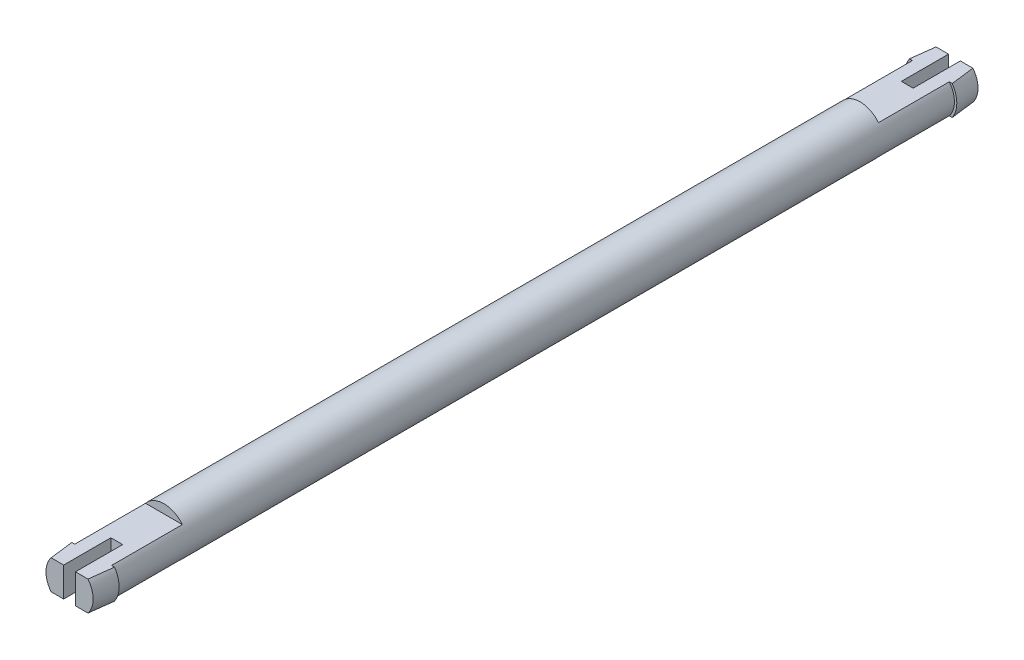
ISO-10303-21;
HEADER;
FILE_DESCRIPTION(('STEP AP214'),'2;1');
FILE_NAME('part.step','',(''),(''),'','','');
FILE_SCHEMA(('AUTOMOTIVE_DESIGN { 1 0 10303 214 1 1 1 1 }'));
ENDSEC;
DATA;
#1=APPLICATION_CONTEXT('core data for automotive mechanical design processes');
#2=APPLICATION_PROTOCOL_DEFINITION('international standard','automotive_design',2000,#1);
#3=PRODUCT_CONTEXT('',#1,'mechanical');
#4=PRODUCT('Part','Part','',(#3));
#5=PRODUCT_RELATED_PRODUCT_CATEGORY('part','',(#4));
#6=PRODUCT_DEFINITION_FORMATION('','',#4);
#7=PRODUCT_DEFINITION_CONTEXT('part definition',#1,'design');
#8=PRODUCT_DEFINITION('design','',#6,#7);
#9=PRODUCT_DEFINITION_SHAPE('','',#8);
#10=(LENGTH_UNIT() NAMED_UNIT(*) SI_UNIT(.MILLI.,.METRE.));
#11=(NAMED_UNIT(*) PLANE_ANGLE_UNIT() SI_UNIT($,.RADIAN.));
#12=(NAMED_UNIT(*) SI_UNIT($,.STERADIAN.) SOLID_ANGLE_UNIT());
#13=UNCERTAINTY_MEASURE_WITH_UNIT(LENGTH_MEASURE(1.E-05),#10,'distance_accuracy_value','');
#14=(GEOMETRIC_REPRESENTATION_CONTEXT(3) GLOBAL_UNCERTAINTY_ASSIGNED_CONTEXT((#13)) GLOBAL_UNIT_ASSIGNED_CONTEXT((#10,
#11,#12)) REPRESENTATION_CONTEXT('',''));
#15=CARTESIAN_POINT('',(0.,0.,0.));
#16=DIRECTION('',(0.,0.,1.));
#17=DIRECTION('',(1.,0.,0.));
#18=AXIS2_PLACEMENT_3D('',#15,#16,#17);
#19=CARTESIAN_POINT('',(0.,0.,-75.));
#20=DIRECTION('',(0.,0.,1.));
#21=DIRECTION('',(1.,0.,0.));
#22=AXIS2_PLACEMENT_3D('',#19,#20,#21);
#23=PLANE('',#22);
#24=DIRECTION('',(-1.,0.,0.));
#25=VECTOR('',#24,1.);
#26=CARTESIAN_POINT('',(0.,-1.25,-75.));
#27=LINE('',#26,#25);
#28=CARTESIAN_POINT('',(1.5612494995996,-1.25,-75.));
#29=VERTEX_POINT('',#28);
#30=CARTESIAN_POINT('',(0.499999999999997,-1.25,-75.));
#31=VERTEX_POINT('',#30);
#32=EDGE_CURVE('E213',#29,#31,#27,.T.);
#33=ORIENTED_EDGE('',*,*,#32,.T.);
#34=DIRECTION('',(0.,1.,0.));
#35=VECTOR('',#34,1.);
#36=CARTESIAN_POINT('',(0.499999999999997,-2.,-75.));
#37=LINE('',#36,#35);
#38=CARTESIAN_POINT('',(0.499999999999997,1.25,-75.));
#39=VERTEX_POINT('',#38);
#40=EDGE_CURVE('E199',#31,#39,#37,.T.);
#41=ORIENTED_EDGE('',*,*,#40,.T.);
#42=DIRECTION('',(1.,0.,0.));
#43=VECTOR('',#42,1.);
#44=CARTESIAN_POINT('',(0.,1.25,-75.));
#45=LINE('',#44,#43);
#46=CARTESIAN_POINT('',(1.5612494995996,1.25,-75.));
#47=VERTEX_POINT('',#46);
#48=EDGE_CURVE('E211',#39,#47,#45,.T.);
#49=ORIENTED_EDGE('',*,*,#48,.T.);
#50=CARTESIAN_POINT('',(0.,0.,-75.));
#51=DIRECTION('',(0.,0.,1.));
#52=DIRECTION('',(1.,0.,0.));
#53=AXIS2_PLACEMENT_3D('',#50,#51,#52);
#54=CIRCLE('',#53,2.);
#55=EDGE_CURVE('E408',#29,#47,#54,.T.);
#56=ORIENTED_EDGE('',*,*,#55,.F.);
#57=EDGE_LOOP('',(#33,#41,#49,#56));
#58=FACE_BOUND('',#57,.T.);
#59=ADVANCED_FACE('F34',(#58),#23,.F.);
#60=CARTESIAN_POINT('',(0.,0.,-73.));
#61=DIRECTION('',(0.,0.,1.));
#62=DIRECTION('',(1.,0.,0.));
#63=AXIS2_PLACEMENT_3D('',#60,#61,#62);
#64=PLANE('',#63);
#65=DIRECTION('',(-1.,0.,0.));
#66=VECTOR('',#65,1.);
#67=CARTESIAN_POINT('',(0.,-1.25,-73.));
#68=LINE('',#67,#66);
#69=CARTESIAN_POINT('',(1.81038669902327,-1.25,-73.0000000000001));
#70=VERTEX_POINT('',#69);
#71=CARTESIAN_POINT('',(1.5612494995996,-1.25,-73.));
#72=VERTEX_POINT('',#71);
#73=EDGE_CURVE('E260',#70,#72,#68,.T.);
#74=ORIENTED_EDGE('',*,*,#73,.F.);
#75=CARTESIAN_POINT('',(0.,0.,-73.));
#76=DIRECTION('',(0.,0.,1.));
#77=DIRECTION('',(1.,0.,0.));
#78=AXIS2_PLACEMENT_3D('',#75,#76,#77);
#79=CIRCLE('',#78,2.2);
#80=CARTESIAN_POINT('',(1.81038669902326,1.25,-73.0000000000001));
#81=VERTEX_POINT('',#80);
#82=EDGE_CURVE('E307',#70,#81,#79,.T.);
#83=ORIENTED_EDGE('',*,*,#82,.T.);
#84=DIRECTION('',(1.,0.,0.));
#85=VECTOR('',#84,1.);
#86=CARTESIAN_POINT('',(0.,1.25,-73.));
#87=LINE('',#86,#85);
#88=CARTESIAN_POINT('',(1.5612494995996,1.25,-73.));
#89=VERTEX_POINT('',#88);
#90=EDGE_CURVE('E291',#89,#81,#87,.T.);
#91=ORIENTED_EDGE('',*,*,#90,.F.);
#92=CARTESIAN_POINT('',(0.,0.,-73.));
#93=DIRECTION('',(0.,0.,1.));
#94=DIRECTION('',(1.,0.,0.));
#95=AXIS2_PLACEMENT_3D('',#92,#93,#94);
#96=CIRCLE('',#95,2.);
#97=EDGE_CURVE('E223',#89,#72,#96,.F.);
#98=ORIENTED_EDGE('',*,*,#97,.T.);
#99=EDGE_LOOP('',(#74,#83,#91,#98));
#100=FACE_BOUND('',#99,.T.);
#101=ADVANCED_FACE('F449',(#100),#64,.T.);
#102=CARTESIAN_POINT('',(0.,0.,-73.));
#103=DIRECTION('',(0.,0.,1.));
#104=DIRECTION('',(1.,0.,0.));
#105=AXIS2_PLACEMENT_3D('',#102,#103,#104);
#106=CONICAL_SURFACE('',#105,2.2,0.0996686524911592);
#107=CARTESIAN_POINT('',(-2.07154781563105,-1.25,-70.8053511030935));
#108=CARTESIAN_POINT('',(-2.03550722726414,-1.25,-71.1139180179247));
#109=CARTESIAN_POINT('',(-1.99922295149763,-1.25,-71.4224563190549));
#110=CARTESIAN_POINT('',(-1.92607039278533,-1.25,-72.0394648246496));
#111=CARTESIAN_POINT('',(-1.88920210764816,-1.25,-72.3479350288541));
#112=CARTESIAN_POINT('',(-1.77758091435319,-1.25,-73.2731887554345));
#113=CARTESIAN_POINT('',(-1.70180760472733,-1.25,-73.889850372761));
#114=CARTESIAN_POINT('',(-1.58512147260778,-1.25,-74.8144760218349));
#115=CARTESIAN_POINT('',(-1.54572075887384,-1.25,-75.122630781761));
#116=CARTESIAN_POINT('',(-1.46564062998624,-1.25,-75.73877265943));
#117=CARTESIAN_POINT('',(-1.42496122188893,-1.25,-76.0467597780886));
#118=CARTESIAN_POINT('',(-1.34198072748193,-1.25,-76.6625339402323));
#119=CARTESIAN_POINT('',(-1.29967955336675,-1.25,-76.9703209719642));
#120=CARTESIAN_POINT('',(-1.21285635248197,-1.25,-77.5855868834585));
#121=CARTESIAN_POINT('',(-1.1683342833841,-1.25,-77.8930657572336));
#122=CARTESIAN_POINT('',(-1.12240193199716,-1.25,-78.2003390005902));
#123=B_SPLINE_CURVE_WITH_KNOTS('',3,(#107,#108,#109,#110,#111,#112,#113,#114,#115,#116,#117,
#118,#119,#120,#121,#122),.UNSPECIFIED.,.F.,.F.,(4,2,2,2,2,2,2,4),(0.,0.93199316576233,
1.86398982945298,3.72787750877082,4.65986577266916,5.59184889439997,6.5238825469239,
7.45593396996273),.UNSPECIFIED.);
#124=CARTESIAN_POINT('',(-1.81038669902327,-1.25,-73.0000000000001));
#125=VERTEX_POINT('',#124);
#126=CARTESIAN_POINT('',(-1.5612494995996,-1.25,-75.));
#127=VERTEX_POINT('',#126);
#128=EDGE_CURVE('E275',#125,#127,#123,.T.);
#129=ORIENTED_EDGE('',*,*,#128,.F.);
#130=CARTESIAN_POINT('',(-1.81038669902327,1.25,-73.0000000000001));
#131=VERTEX_POINT('',#130);
#132=EDGE_CURVE('E308',#131,#125,#79,.T.);
#133=ORIENTED_EDGE('',*,*,#132,.F.);
#134=CARTESIAN_POINT('',(-1.12240193199716,1.25,-78.2003390005902));
#135=CARTESIAN_POINT('',(-1.16007318188193,1.25,-77.9484550212629));
#136=CARTESIAN_POINT('',(-1.1967756822207,1.25,-77.6964288561933));
#137=CARTESIAN_POINT('',(-1.26860770564259,1.25,-77.1921552657798));
#138=CARTESIAN_POINT('',(-1.30373724824444,1.25,-76.9399078432212));
#139=CARTESIAN_POINT('',(-1.37278762127906,1.25,-76.4352571718187));
#140=CARTESIAN_POINT('',(-1.40670849276506,1.25,-76.1828539285641));
#141=CARTESIAN_POINT('',(-1.47357063225508,1.25,-75.6779171395039));
#142=CARTESIAN_POINT('',(-1.50651189747343,1.25,-75.4253835933298));
#143=CARTESIAN_POINT('',(-1.56766910496902,1.25,-74.9506559350624));
#144=CARTESIAN_POINT('',(-1.59597605442952,1.25,-74.7284735200067));
#145=CARTESIAN_POINT('',(-1.66291250795864,1.25,-74.1980433208731));
#146=CARTESIAN_POINT('',(-1.70129728585269,1.25,-73.8897646573885));
#147=CARTESIAN_POINT('',(-1.77723656698477,1.25,-73.2731045277542));
#148=CARTESIAN_POINT('',(-1.81479106820384,1.25,-72.9647230613564));
#149=CARTESIAN_POINT('',(-1.88921121609686,1.25,-72.3478817112025));
#150=CARTESIAN_POINT('',(-1.92607687286844,1.25,-72.0394218286632));
#151=CARTESIAN_POINT('',(-1.99922418459548,1.25,-71.4224342581658));
#152=CARTESIAN_POINT('',(-2.0355058422845,1.25,-71.1139065705321));
#153=CARTESIAN_POINT('',(-2.07154781563105,1.25,-70.8053511030935));
#154=B_SPLINE_CURVE_WITH_KNOTS('',3,(#134,#135,#136,#137,#138,#139,#140,#141,#142,#143,#144,
#145,#146,#147,#148,#149,#150,#151,#152,#153),.UNSPECIFIED.,.F.,.F.,(4,2,2,2,2,2,2,2,2,4),(0.,
0.764050536151596,1.52809158862139,2.29210666519179,3.05612391415671,3.72805834866274,
4.66003438385202,5.59201268506309,6.52397731386891,7.45593757911203),.UNSPECIFIED.);
#155=CARTESIAN_POINT('',(-1.5612494995996,1.25,-75.));
#156=VERTEX_POINT('',#155);
#157=EDGE_CURVE('E298',#156,#131,#154,.T.);
#158=ORIENTED_EDGE('',*,*,#157,.F.);
#159=EDGE_CURVE('E409',#156,#127,#54,.T.);
#160=ORIENTED_EDGE('',*,*,#159,.T.);
#161=EDGE_LOOP('',(#129,#133,#158,#160));
#162=FACE_BOUND('',#161,.T.);
#163=ADVANCED_FACE('F455',(#162),#106,.T.);
#164=CARTESIAN_POINT('',(0.,0.,0.));
#165=DIRECTION('',(0.,0.,1.));
#166=DIRECTION('',(1.,0.,0.));
#167=AXIS2_PLACEMENT_3D('',#164,#165,#166);
#168=PLANE('',#167);
#169=DIRECTION('',(0.,-1.,0.));
#170=VECTOR('',#169,1.);
#171=CARTESIAN_POINT('',(-0.5,2.001,0.));
#172=LINE('',#171,#170);
#173=CARTESIAN_POINT('',(-0.5,1.25,0.));
#174=VERTEX_POINT('',#173);
#175=CARTESIAN_POINT('',(-0.5,-1.25,0.));
#176=VERTEX_POINT('',#175);
#177=EDGE_CURVE('E324',#174,#176,#172,.T.);
#178=ORIENTED_EDGE('',*,*,#177,.F.);
#179=DIRECTION('',(1.,0.,0.));
#180=VECTOR('',#179,1.);
#181=CARTESIAN_POINT('',(0.,1.25,0.));
#182=LINE('',#181,#180);
#183=CARTESIAN_POINT('',(-1.5612494995996,1.25,0.));
#184=VERTEX_POINT('',#183);
#185=EDGE_CURVE('E423',#184,#174,#182,.T.);
#186=ORIENTED_EDGE('',*,*,#185,.F.);
#187=CARTESIAN_POINT('',(0.,0.,0.));
#188=DIRECTION('',(0.,0.,1.));
#189=DIRECTION('',(1.,0.,0.));
#190=AXIS2_PLACEMENT_3D('',#187,#188,#189);
#191=CIRCLE('',#190,2.);
#192=CARTESIAN_POINT('',(-1.5612494995996,-1.25,0.));
#193=VERTEX_POINT('',#192);
#194=EDGE_CURVE('E404',#184,#193,#191,.T.);
#195=ORIENTED_EDGE('',*,*,#194,.T.);
#196=DIRECTION('',(-1.,0.,0.));
#197=VECTOR('',#196,1.);
#198=CARTESIAN_POINT('',(0.,-1.25,0.));
#199=LINE('',#198,#197);
#200=EDGE_CURVE('E416',#176,#193,#199,.T.);
#201=ORIENTED_EDGE('',*,*,#200,.F.);
#202=EDGE_LOOP('',(#178,#186,#195,#201));
#203=FACE_BOUND('',#202,.T.);
#204=ADVANCED_FACE('F479',(#203),#168,.T.);
#205=CARTESIAN_POINT('',(0.,0.,0.));
#206=DIRECTION('',(0.,0.,-1.));
#207=DIRECTION('',(-1.,0.,0.));
#208=AXIS2_PLACEMENT_3D('',#205,#206,#207);
#209=CONICAL_SURFACE('',#208,2.,0.0996686524911612);
#210=CARTESIAN_POINT('',(-2.20629085167544,1.25,-5.35787712366069));
#211=CARTESIAN_POINT('',(-2.16911364127435,1.25,-5.03442418142203));
#212=CARTESIAN_POINT('',(-2.13171451989948,1.25,-4.71099685663596));
#213=CARTESIAN_POINT('',(-2.05638780976397,1.25,-4.06420290953939));
#214=CARTESIAN_POINT('',(-2.01846021960565,1.25,-3.74083628739171));
#215=CARTESIAN_POINT('',(-1.90376109024389,1.25,-2.77086975377676));
#216=CARTESIAN_POINT('',(-1.82607027221003,1.25,-2.12437765306016));
#217=CARTESIAN_POINT('',(-1.70685435031514,1.25,-1.15495865945316));
#218=CARTESIAN_POINT('',(-1.6666684414073,1.25,-0.831867113806437));
#219=CARTESIAN_POINT('',(-1.58517894557185,1.25,-0.185825927060357));
#220=CARTESIAN_POINT('',(-1.54387536251856,1.25,0.137123714526958));
#221=CARTESIAN_POINT('',(-1.45986916908057,1.25,0.782854266012029));
#222=CARTESIAN_POINT('',(-1.41716650618307,1.25,1.10563516911336));
#223=CARTESIAN_POINT('',(-1.32989270639121,1.25,1.75094775860943));
#224=CARTESIAN_POINT('',(-1.28532154707356,1.25,2.07347944196603));
#225=CARTESIAN_POINT('',(-1.23958118370651,1.25,2.39584846975234));
#226=B_SPLINE_CURVE_WITH_KNOTS('',3,(#210,#211,#212,#213,#214,#215,#216,#217,#218,#219,#220,
#221,#222,#223,#224,#225),.UNSPECIFIED.,.F.,.F.,(4,2,2,2,2,2,2,4),(0.,0.976747065340103,
1.95349671443936,3.90691894725974,4.88366075798535,5.86039918335277,6.83717431153944,
7.81396116508773),.UNSPECIFIED.);
#227=CARTESIAN_POINT('',(-1.81038669902317,1.25,-2.));
#228=VERTEX_POINT('',#227);
#229=EDGE_CURVE('E340',#228,#184,#226,.T.);
#230=ORIENTED_EDGE('',*,*,#229,.F.);
#231=CARTESIAN_POINT('',(0.,0.,-2.));
#232=DIRECTION('',(0.,0.,1.));
#233=DIRECTION('',(1.,0.,0.));
#234=AXIS2_PLACEMENT_3D('',#231,#232,#233);
#235=CIRCLE('',#234,2.2);
#236=CARTESIAN_POINT('',(-1.81038669902317,-1.25,-2.));
#237=VERTEX_POINT('',#236);
#238=EDGE_CURVE('E400',#228,#237,#235,.T.);
#239=ORIENTED_EDGE('',*,*,#238,.T.);
#240=CARTESIAN_POINT('',(-1.23958118370651,-1.25,2.39584846975234));
#241=CARTESIAN_POINT('',(-1.27708445163936,-1.25,2.1316265009786));
#242=CARTESIAN_POINT('',(-1.31378723609279,-1.25,1.86729257599781));
#243=CARTESIAN_POINT('',(-1.38587498011765,-1.25,1.33844690886303));
#244=CARTESIAN_POINT('',(-1.42125994975576,-1.25,1.07393516808307));
#245=CARTESIAN_POINT('',(-1.49099498681418,-1.25,0.544781873474838));
#246=CARTESIAN_POINT('',(-1.5253450774814,-1.25,0.280140322698454));
#247=CARTESIAN_POINT('',(-1.59319606726225,-1.25,-0.249251984131472));
#248=CARTESIAN_POINT('',(-1.62669696491898,-1.25,-0.514002740371576));
#249=CARTESIAN_POINT('',(-1.68902097967955,-1.25,-1.01186777884924));
#250=CARTESIAN_POINT('',(-1.71792365975446,-1.25,-1.24497212268678));
#251=CARTESIAN_POINT('',(-1.8260728146173,-1.25,-2.12439276505839));
#252=CARTESIAN_POINT('',(-1.90376491575885,-1.25,-2.77090043818358));
#253=CARTESIAN_POINT('',(-2.01846468029956,-1.25,-3.74087483946421));
#254=CARTESIAN_POINT('',(-2.056391393145,-1.25,-4.06423386196728));
#255=CARTESIAN_POINT('',(-2.13171635303436,-1.25,-4.71101241305846));
#256=CARTESIAN_POINT('',(-2.16911460179215,-1.25,-5.03443194144689));
#257=CARTESIAN_POINT('',(-2.20629085167544,-1.25,-5.35787712366069));
#258=B_SPLINE_CURVE_WITH_KNOTS('',3,(#240,#241,#242,#243,#244,#245,#246,#247,#248,#249,#250,
#251,#252,#253,#254,#255,#256,#257),.UNSPECIFIED.,.F.,.F.,(4,2,2,2,2,2,2,2,4),(0.,
0.800607232202053,1.60120834737589,2.40179146488677,3.2023759557953,3.90704351295182,
5.86051217913123,6.83723890380335,7.81396246011894),.UNSPECIFIED.);
#259=EDGE_CURVE('E392',#193,#237,#258,.T.);
#260=ORIENTED_EDGE('',*,*,#259,.F.);
#261=ORIENTED_EDGE('',*,*,#194,.F.);
#262=EDGE_LOOP('',(#230,#239,#260,#261));
#263=FACE_BOUND('',#262,.T.);
#264=ADVANCED_FACE('F483',(#263),#209,.T.);
#265=CARTESIAN_POINT('',(0.,0.,-2.));
#266=DIRECTION('',(0.,0.,-1.));
#267=DIRECTION('',(-1.,0.,0.));
#268=AXIS2_PLACEMENT_3D('',#265,#266,#267);
#269=PLANE('',#268);
#270=DIRECTION('',(-1.,0.,0.));
#271=VECTOR('',#270,1.);
#272=CARTESIAN_POINT('',(0.,1.25,-2.));
#273=LINE('',#272,#271);
#274=CARTESIAN_POINT('',(1.81038669902317,1.25,-2.));
#275=VERTEX_POINT('',#274);
#276=CARTESIAN_POINT('',(1.5612494995996,1.25,-2.));
#277=VERTEX_POINT('',#276);
#278=EDGE_CURVE('E341',#275,#277,#273,.T.);
#279=ORIENTED_EDGE('',*,*,#278,.F.);
#280=CARTESIAN_POINT('',(1.81038669902317,-1.25,-2.));
#281=VERTEX_POINT('',#280);
#282=EDGE_CURVE('E401',#281,#275,#235,.T.);
#283=ORIENTED_EDGE('',*,*,#282,.F.);
#284=DIRECTION('',(1.,0.,0.));
#285=VECTOR('',#284,1.);
#286=CARTESIAN_POINT('',(0.,-1.25,-2.));
#287=LINE('',#286,#285);
#288=CARTESIAN_POINT('',(1.5612494995996,-1.25,-2.));
#289=VERTEX_POINT('',#288);
#290=EDGE_CURVE('E375',#289,#281,#287,.T.);
#291=ORIENTED_EDGE('',*,*,#290,.F.);
#292=CARTESIAN_POINT('',(0.,0.,-2.));
#293=DIRECTION('',(0.,0.,-1.));
#294=DIRECTION('',(-1.,0.,0.));
#295=AXIS2_PLACEMENT_3D('',#292,#293,#294);
#296=CIRCLE('',#295,2.);
#297=EDGE_CURVE('E413',#289,#277,#296,.F.);
#298=ORIENTED_EDGE('',*,*,#297,.T.);
#299=EDGE_LOOP('',(#279,#283,#291,#298));
#300=FACE_BOUND('',#299,.T.);
#301=ADVANCED_FACE('F488',(#300),#269,.T.);
#302=CARTESIAN_POINT('',(0.,0.,-75.));
#303=DIRECTION('',(0.,0.,1.));
#304=DIRECTION('',(1.,0.,0.));
#305=AXIS2_PLACEMENT_3D('',#302,#303,#304);
#306=CYLINDRICAL_SURFACE('',#305,2.);
#307=DIRECTION('',(0.,0.,1.));
#308=VECTOR('',#307,1.);
#309=CARTESIAN_POINT('',(-1.5612494995996,-1.25,-75.));
#310=LINE('',#309,#308);
#311=CARTESIAN_POINT('',(-1.5612494995996,-1.25,-67.));
#312=VERTEX_POINT('',#311);
#313=CARTESIAN_POINT('',(-1.5612494995996,-1.25,-73.));
#314=VERTEX_POINT('',#313);
#315=EDGE_CURVE('E282',#312,#314,#310,.F.);
#316=ORIENTED_EDGE('',*,*,#315,.F.);
#317=CARTESIAN_POINT('',(0.,0.,-67.));
#318=DIRECTION('',(0.,0.,-1.));
#319=DIRECTION('',(-1.,0.,0.));
#320=AXIS2_PLACEMENT_3D('',#317,#318,#319);
#321=CIRCLE('',#320,2.);
#322=CARTESIAN_POINT('',(1.5612494995996,-1.25,-67.));
#323=VERTEX_POINT('',#322);
#324=EDGE_CURVE('E234',#312,#323,#321,.F.);
#325=ORIENTED_EDGE('',*,*,#324,.T.);
#326=DIRECTION('',(0.,0.,1.));
#327=VECTOR('',#326,1.);
#328=CARTESIAN_POINT('',(1.5612494995996,-1.25,-75.));
#329=LINE('',#328,#327);
#330=EDGE_CURVE('E281',#72,#323,#329,.T.);
#331=ORIENTED_EDGE('',*,*,#330,.F.);
#332=ORIENTED_EDGE('',*,*,#97,.F.);
#333=DIRECTION('',(0.,0.,1.));
#334=VECTOR('',#333,1.);
#335=CARTESIAN_POINT('',(1.5612494995996,1.25,-75.));
#336=LINE('',#335,#334);
#337=CARTESIAN_POINT('',(1.5612494995996,1.25,-67.));
#338=VERTEX_POINT('',#337);
#339=EDGE_CURVE('E304',#338,#89,#336,.F.);
#340=ORIENTED_EDGE('',*,*,#339,.F.);
#341=CARTESIAN_POINT('',(0.,0.,-67.));
#342=DIRECTION('',(0.,0.,1.));
#343=DIRECTION('',(1.,0.,0.));
#344=AXIS2_PLACEMENT_3D('',#341,#342,#343);
#345=CIRCLE('',#344,2.);
#346=CARTESIAN_POINT('',(-1.5612494995996,1.25,-67.));
#347=VERTEX_POINT('',#346);
#348=EDGE_CURVE('E226',#347,#338,#345,.F.);
#349=ORIENTED_EDGE('',*,*,#348,.F.);
#350=DIRECTION('',(0.,0.,1.));
#351=VECTOR('',#350,1.);
#352=CARTESIAN_POINT('',(-1.5612494995996,1.25,-75.));
#353=LINE('',#352,#351);
#354=CARTESIAN_POINT('',(-1.5612494995996,1.25,-73.));
#355=VERTEX_POINT('',#354);
#356=EDGE_CURVE('E305',#355,#347,#353,.T.);
#357=ORIENTED_EDGE('',*,*,#356,.F.);
#358=EDGE_CURVE('E228',#314,#355,#96,.F.);
#359=ORIENTED_EDGE('',*,*,#358,.F.);
#360=EDGE_LOOP('',(#316,#325,#331,#332,#340,#349,#357,#359));
#361=FACE_BOUND('',#360,.T.);
#362=DIRECTION('',(0.,0.,1.));
#363=VECTOR('',#362,1.);
#364=CARTESIAN_POINT('',(1.5612494995996,1.25,-75.));
#365=LINE('',#364,#363);
#366=CARTESIAN_POINT('',(1.5612494995996,1.25,-7.99999999999999));
#367=VERTEX_POINT('',#366);
#368=EDGE_CURVE('E370',#277,#367,#365,.F.);
#369=ORIENTED_EDGE('',*,*,#368,.F.);
#370=ORIENTED_EDGE('',*,*,#297,.F.);
#371=DIRECTION('',(0.,0.,1.));
#372=VECTOR('',#371,1.);
#373=CARTESIAN_POINT('',(1.5612494995996,-1.25,-75.));
#374=LINE('',#373,#372);
#375=CARTESIAN_POINT('',(1.5612494995996,-1.25,-7.99999999999999));
#376=VERTEX_POINT('',#375);
#377=EDGE_CURVE('E383',#376,#289,#374,.T.);
#378=ORIENTED_EDGE('',*,*,#377,.F.);
#379=CARTESIAN_POINT('',(0.,0.,-7.99999999999999));
#380=DIRECTION('',(0.,0.,-1.));
#381=DIRECTION('',(-1.,0.,0.));
#382=AXIS2_PLACEMENT_3D('',#379,#380,#381);
#383=CIRCLE('',#382,2.);
#384=CARTESIAN_POINT('',(-1.5612494995996,-1.25,-7.99999999999999));
#385=VERTEX_POINT('',#384);
#386=EDGE_CURVE('E420',#385,#376,#383,.F.);
#387=ORIENTED_EDGE('',*,*,#386,.F.);
#388=DIRECTION('',(0.,0.,1.));
#389=VECTOR('',#388,1.);
#390=CARTESIAN_POINT('',(-1.5612494995996,-1.25,-75.));
#391=LINE('',#390,#389);
#392=CARTESIAN_POINT('',(-1.5612494995996,-1.25,-2.));
#393=VERTEX_POINT('',#392);
#394=EDGE_CURVE('E398',#393,#385,#391,.F.);
#395=ORIENTED_EDGE('',*,*,#394,.F.);
#396=CARTESIAN_POINT('',(-1.5612494995996,1.25,-2.));
#397=VERTEX_POINT('',#396);
#398=EDGE_CURVE('E412',#397,#393,#296,.F.);
#399=ORIENTED_EDGE('',*,*,#398,.F.);
#400=DIRECTION('',(0.,0.,1.));
#401=VECTOR('',#400,1.);
#402=CARTESIAN_POINT('',(-1.5612494995996,1.25,-75.));
#403=LINE('',#402,#401);
#404=CARTESIAN_POINT('',(-1.5612494995996,1.25,-7.99999999999999));
#405=VERTEX_POINT('',#404);
#406=EDGE_CURVE('E348',#405,#397,#403,.T.);
#407=ORIENTED_EDGE('',*,*,#406,.F.);
#408=CARTESIAN_POINT('',(0.,0.,-7.99999999999999));
#409=DIRECTION('',(0.,0.,-1.));
#410=DIRECTION('',(-1.,0.,0.));
#411=AXIS2_PLACEMENT_3D('',#408,#409,#410);
#412=CIRCLE('',#411,2.);
#413=EDGE_CURVE('E425',#367,#405,#412,.F.);
#414=ORIENTED_EDGE('',*,*,#413,.F.);
#415=EDGE_LOOP('',(#369,#370,#378,#387,#395,#399,#407,#414));
#416=FACE_BOUND('',#415,.T.);
#417=ADVANCED_FACE('F36',(#361,#416),#306,.T.);
#418=CARTESIAN_POINT('',(1.23958118370651,1.25,2.39584846975234));
#419=CARTESIAN_POINT('',(1.27708445163936,1.25,2.1316265009786));
#420=CARTESIAN_POINT('',(1.31378723609279,1.25,1.86729257599781));
#421=CARTESIAN_POINT('',(1.38587498011765,1.25,1.33844690886303));
#422=CARTESIAN_POINT('',(1.42125994975576,1.25,1.07393516808307));
#423=CARTESIAN_POINT('',(1.49099498681418,1.25,0.544781873474838));
#424=CARTESIAN_POINT('',(1.5253450774814,1.25,0.280140322698454));
#425=CARTESIAN_POINT('',(1.59319606726225,1.25,-0.249251984131472));
#426=CARTESIAN_POINT('',(1.62669696491898,1.25,-0.514002740371576));
#427=CARTESIAN_POINT('',(1.68902097967955,1.25,-1.01186777884924));
#428=CARTESIAN_POINT('',(1.71792365975446,1.25,-1.24497212268678));
#429=CARTESIAN_POINT('',(1.8260728146173,1.25,-2.12439276505839));
#430=CARTESIAN_POINT('',(1.90376491575885,1.25,-2.77090043818358));
#431=CARTESIAN_POINT('',(2.01846468029956,1.25,-3.74087483946421));
#432=CARTESIAN_POINT('',(2.056391393145,1.25,-4.06423386196728));
#433=CARTESIAN_POINT('',(2.13171635303436,1.25,-4.71101241305846));
#434=CARTESIAN_POINT('',(2.16911460179215,1.25,-5.03443194144689));
#435=CARTESIAN_POINT('',(2.20629085167544,1.25,-5.35787712366069));
#436=B_SPLINE_CURVE_WITH_KNOTS('',3,(#418,#419,#420,#421,#422,#423,#424,#425,#426,#427,#428,
#429,#430,#431,#432,#433,#434,#435),.UNSPECIFIED.,.F.,.F.,(4,2,2,2,2,2,2,2,4),(0.,
0.800607232202053,1.60120834737589,2.40179146488677,3.2023759557953,3.90704351295182,
5.86051217913123,6.83723890380335,7.81396246011894),.UNSPECIFIED.);
#437=CARTESIAN_POINT('',(1.5612494995996,1.25,0.));
#438=VERTEX_POINT('',#437);
#439=EDGE_CURVE('E365',#438,#275,#436,.T.);
#440=ORIENTED_EDGE('',*,*,#439,.F.);
#441=CARTESIAN_POINT('',(1.5612494995996,-1.25,0.));
#442=VERTEX_POINT('',#441);
#443=EDGE_CURVE('E405',#442,#438,#191,.T.);
#444=ORIENTED_EDGE('',*,*,#443,.F.);
#445=CARTESIAN_POINT('',(2.20629085167544,-1.25,-5.35787712366069));
#446=CARTESIAN_POINT('',(2.16911364127435,-1.25,-5.03442418142203));
#447=CARTESIAN_POINT('',(2.13171451989948,-1.25,-4.71099685663596));
#448=CARTESIAN_POINT('',(2.05638780976397,-1.25,-4.06420290953939));
#449=CARTESIAN_POINT('',(2.01846021960565,-1.25,-3.74083628739171));
#450=CARTESIAN_POINT('',(1.90376109024389,-1.25,-2.77086975377676));
#451=CARTESIAN_POINT('',(1.82607027221003,-1.25,-2.12437765306016));
#452=CARTESIAN_POINT('',(1.70685435031514,-1.25,-1.15495865945316));
#453=CARTESIAN_POINT('',(1.6666684414073,-1.25,-0.831867113806437));
#454=CARTESIAN_POINT('',(1.58517894557185,-1.25,-0.185825927060357));
#455=CARTESIAN_POINT('',(1.54387536251856,-1.25,0.137123714526958));
#456=CARTESIAN_POINT('',(1.45986916908057,-1.25,0.782854266012029));
#457=CARTESIAN_POINT('',(1.41716650618307,-1.25,1.10563516911336));
#458=CARTESIAN_POINT('',(1.32989270639121,-1.25,1.75094775860943));
#459=CARTESIAN_POINT('',(1.28532154707356,-1.25,2.07347944196603));
#460=CARTESIAN_POINT('',(1.23958118370651,-1.25,2.39584846975234));
#461=B_SPLINE_CURVE_WITH_KNOTS('',3,(#445,#446,#447,#448,#449,#450,#451,#452,#453,#454,#455,
#456,#457,#458,#459,#460),.UNSPECIFIED.,.F.,.F.,(4,2,2,2,2,2,2,4),(0.,0.976747065340103,
1.95349671443936,3.90691894725974,4.88366075798535,5.86039918335277,6.83717431153944,
7.81396116508773),.UNSPECIFIED.);
#462=EDGE_CURVE('E377',#281,#442,#461,.T.);
#463=ORIENTED_EDGE('',*,*,#462,.F.);
#464=ORIENTED_EDGE('',*,*,#282,.T.);
#465=EDGE_LOOP('',(#440,#444,#463,#464));
#466=FACE_BOUND('',#465,.T.);
#467=ADVANCED_FACE('F350',(#466),#209,.T.);
#468=EDGE_CURVE('E338',#397,#228,#273,.T.);
#469=ORIENTED_EDGE('',*,*,#468,.F.);
#470=ORIENTED_EDGE('',*,*,#398,.T.);
#471=EDGE_CURVE('E378',#237,#393,#287,.T.);
#472=ORIENTED_EDGE('',*,*,#471,.F.);
#473=ORIENTED_EDGE('',*,*,#238,.F.);
#474=EDGE_LOOP('',(#469,#470,#472,#473));
#475=FACE_BOUND('',#474,.T.);
#476=ADVANCED_FACE('F390',(#475),#269,.T.);
#477=DIRECTION('',(0.,-1.,0.));
#478=VECTOR('',#477,1.);
#479=CARTESIAN_POINT('',(0.5,2.001,0.));
#480=LINE('',#479,#478);
#481=CARTESIAN_POINT('',(0.5,1.25,0.));
#482=VERTEX_POINT('',#481);
#483=CARTESIAN_POINT('',(0.5,-1.25,0.));
#484=VERTEX_POINT('',#483);
#485=EDGE_CURVE('E327',#482,#484,#480,.T.);
#486=ORIENTED_EDGE('',*,*,#485,.T.);
#487=EDGE_CURVE('E417',#442,#484,#199,.T.);
#488=ORIENTED_EDGE('',*,*,#487,.F.);
#489=ORIENTED_EDGE('',*,*,#443,.T.);
#490=EDGE_CURVE('E422',#482,#438,#182,.T.);
#491=ORIENTED_EDGE('',*,*,#490,.F.);
#492=EDGE_LOOP('',(#486,#488,#489,#491));
#493=FACE_BOUND('',#492,.T.);
#494=ADVANCED_FACE('F388',(#493),#168,.T.);
#495=CARTESIAN_POINT('',(-2.1,-1.25,-8.));
#496=DIRECTION('',(0.,1.,0.));
#497=DIRECTION('',(0.,0.,1.));
#498=AXIS2_PLACEMENT_3D('',#495,#496,#497);
#499=PLANE('',#498);
#500=DIRECTION('',(1.,0.,0.));
#501=VECTOR('',#500,1.);
#502=CARTESIAN_POINT('',(-0.5,-1.25,-4.));
#503=LINE('',#502,#501);
#504=CARTESIAN_POINT('',(-0.5,-1.25,-4.));
#505=VERTEX_POINT('',#504);
#506=CARTESIAN_POINT('',(0.5,-1.25,-4.));
#507=VERTEX_POINT('',#506);
#508=EDGE_CURVE('E318',#505,#507,#503,.T.);
#509=ORIENTED_EDGE('',*,*,#508,.F.);
#510=DIRECTION('',(0.,0.,-1.));
#511=VECTOR('',#510,1.);
#512=CARTESIAN_POINT('',(-0.5,-1.25,0.));
#513=LINE('',#512,#511);
#514=EDGE_CURVE('E315',#176,#505,#513,.T.);
#515=ORIENTED_EDGE('',*,*,#514,.F.);
#516=ORIENTED_EDGE('',*,*,#200,.T.);
#517=ORIENTED_EDGE('',*,*,#259,.T.);
#518=ORIENTED_EDGE('',*,*,#471,.T.);
#519=ORIENTED_EDGE('',*,*,#394,.T.);
#520=DIRECTION('',(-1.,0.,0.));
#521=VECTOR('',#520,1.);
#522=CARTESIAN_POINT('',(-2.1,-1.25,-8.));
#523=LINE('',#522,#521);
#524=EDGE_CURVE('E372',#376,#385,#523,.T.);
#525=ORIENTED_EDGE('',*,*,#524,.F.);
#526=ORIENTED_EDGE('',*,*,#377,.T.);
#527=ORIENTED_EDGE('',*,*,#290,.T.);
#528=ORIENTED_EDGE('',*,*,#462,.T.);
#529=ORIENTED_EDGE('',*,*,#487,.T.);
#530=DIRECTION('',(0.,0.,1.));
#531=VECTOR('',#530,1.);
#532=CARTESIAN_POINT('',(0.5,-1.25,0.));
#533=LINE('',#532,#531);
#534=EDGE_CURVE('E321',#507,#484,#533,.T.);
#535=ORIENTED_EDGE('',*,*,#534,.F.);
#536=EDGE_LOOP('',(#509,#515,#516,#517,#518,#519,#525,#526,#527,#528,#529,#535));
#537=FACE_BOUND('',#536,.T.);
#538=ADVANCED_FACE('F385',(#537),#499,.F.);
#539=CARTESIAN_POINT('',(-2.1,-1.25,-8.));
#540=DIRECTION('',(0.,0.,-1.));
#541=DIRECTION('',(-1.,0.,0.));
#542=AXIS2_PLACEMENT_3D('',#539,#540,#541);
#543=PLANE('',#542);
#544=ORIENTED_EDGE('',*,*,#386,.T.);
#545=ORIENTED_EDGE('',*,*,#524,.T.);
#546=EDGE_LOOP('',(#544,#545));
#547=FACE_BOUND('',#546,.T.);
#548=ADVANCED_FACE('F360',(#547),#543,.F.);
#549=CARTESIAN_POINT('',(-2.1,1.25,-8.));
#550=DIRECTION('',(0.,-1.,0.));
#551=DIRECTION('',(0.,0.,-1.));
#552=AXIS2_PLACEMENT_3D('',#549,#550,#551);
#553=PLANE('',#552);
#554=ORIENTED_EDGE('',*,*,#185,.T.);
#555=DIRECTION('',(0.,0.,1.));
#556=VECTOR('',#555,1.);
#557=CARTESIAN_POINT('',(-0.5,1.25,0.));
#558=LINE('',#557,#556);
#559=CARTESIAN_POINT('',(-0.5,1.25,-4.));
#560=VERTEX_POINT('',#559);
#561=EDGE_CURVE('E313',#560,#174,#558,.T.);
#562=ORIENTED_EDGE('',*,*,#561,.F.);
#563=DIRECTION('',(-1.,0.,0.));
#564=VECTOR('',#563,1.);
#565=CARTESIAN_POINT('',(-0.5,1.25,-4.));
#566=LINE('',#565,#564);
#567=CARTESIAN_POINT('',(0.5,1.25,-4.));
#568=VERTEX_POINT('',#567);
#569=EDGE_CURVE('E326',#568,#560,#566,.T.);
#570=ORIENTED_EDGE('',*,*,#569,.F.);
#571=DIRECTION('',(0.,0.,-1.));
#572=VECTOR('',#571,1.);
#573=CARTESIAN_POINT('',(0.5,1.25,0.));
#574=LINE('',#573,#572);
#575=EDGE_CURVE('E311',#482,#568,#574,.T.);
#576=ORIENTED_EDGE('',*,*,#575,.F.);
#577=ORIENTED_EDGE('',*,*,#490,.T.);
#578=ORIENTED_EDGE('',*,*,#439,.T.);
#579=ORIENTED_EDGE('',*,*,#278,.T.);
#580=ORIENTED_EDGE('',*,*,#368,.T.);
#581=DIRECTION('',(1.,0.,0.));
#582=VECTOR('',#581,1.);
#583=CARTESIAN_POINT('',(-2.1,1.25,-8.));
#584=LINE('',#583,#582);
#585=EDGE_CURVE('E335',#405,#367,#584,.T.);
#586=ORIENTED_EDGE('',*,*,#585,.F.);
#587=ORIENTED_EDGE('',*,*,#406,.T.);
#588=ORIENTED_EDGE('',*,*,#468,.T.);
#589=ORIENTED_EDGE('',*,*,#229,.T.);
#590=EDGE_LOOP('',(#554,#562,#570,#576,#577,#578,#579,#580,#586,#587,#588,#589));
#591=FACE_BOUND('',#590,.T.);
#592=ADVANCED_FACE('F354',(#591),#553,.F.);
#593=CARTESIAN_POINT('',(2.1,2.25,-8.));
#594=DIRECTION('',(0.,0.,-1.));
#595=DIRECTION('',(-1.,0.,0.));
#596=AXIS2_PLACEMENT_3D('',#593,#594,#595);
#597=PLANE('',#596);
#598=ORIENTED_EDGE('',*,*,#413,.T.);
#599=ORIENTED_EDGE('',*,*,#585,.T.);
#600=EDGE_LOOP('',(#598,#599));
#601=FACE_BOUND('',#600,.T.);
#602=ADVANCED_FACE('F359',(#601),#597,.F.);
#603=CARTESIAN_POINT('',(-0.5,2.001,0.));
#604=DIRECTION('',(-1.,0.,0.));
#605=DIRECTION('',(0.,0.,1.));
#606=AXIS2_PLACEMENT_3D('',#603,#604,#605);
#607=PLANE('',#606);
#608=ORIENTED_EDGE('',*,*,#561,.T.);
#609=ORIENTED_EDGE('',*,*,#177,.T.);
#610=ORIENTED_EDGE('',*,*,#514,.T.);
#611=DIRECTION('',(0.,-1.,0.));
#612=VECTOR('',#611,1.);
#613=CARTESIAN_POINT('',(-0.5,2.001,-4.));
#614=LINE('',#613,#612);
#615=EDGE_CURVE('E323',#560,#505,#614,.T.);
#616=ORIENTED_EDGE('',*,*,#615,.F.);
#617=EDGE_LOOP('',(#608,#609,#610,#616));
#618=FACE_BOUND('',#617,.T.);
#619=ADVANCED_FACE('F542',(#618),#607,.F.);
#620=CARTESIAN_POINT('',(0.5,2.001,0.));
#621=DIRECTION('',(1.,0.,0.));
#622=DIRECTION('',(0.,0.,-1.));
#623=AXIS2_PLACEMENT_3D('',#620,#621,#622);
#624=PLANE('',#623);
#625=ORIENTED_EDGE('',*,*,#575,.T.);
#626=DIRECTION('',(0.,-1.,0.));
#627=VECTOR('',#626,1.);
#628=CARTESIAN_POINT('',(0.5,2.001,-4.));
#629=LINE('',#628,#627);
#630=EDGE_CURVE('E330',#568,#507,#629,.T.);
#631=ORIENTED_EDGE('',*,*,#630,.T.);
#632=ORIENTED_EDGE('',*,*,#534,.T.);
#633=ORIENTED_EDGE('',*,*,#485,.F.);
#634=EDGE_LOOP('',(#625,#631,#632,#633));
#635=FACE_BOUND('',#634,.T.);
#636=ADVANCED_FACE('F547',(#635),#624,.F.);
#637=CARTESIAN_POINT('',(-0.5,2.001,-4.));
#638=DIRECTION('',(0.,0.,-1.));
#639=DIRECTION('',(-1.,0.,0.));
#640=AXIS2_PLACEMENT_3D('',#637,#638,#639);
#641=PLANE('',#640);
#642=ORIENTED_EDGE('',*,*,#569,.T.);
#643=ORIENTED_EDGE('',*,*,#615,.T.);
#644=ORIENTED_EDGE('',*,*,#508,.T.);
#645=ORIENTED_EDGE('',*,*,#630,.F.);
#646=EDGE_LOOP('',(#642,#643,#644,#645));
#647=FACE_BOUND('',#646,.T.);
#648=ADVANCED_FACE('F476',(#647),#641,.F.);
#649=EDGE_CURVE('E280',#314,#125,#68,.T.);
#650=ORIENTED_EDGE('',*,*,#649,.F.);
#651=ORIENTED_EDGE('',*,*,#358,.T.);
#652=EDGE_CURVE('E303',#131,#355,#87,.T.);
#653=ORIENTED_EDGE('',*,*,#652,.F.);
#654=ORIENTED_EDGE('',*,*,#132,.T.);
#655=EDGE_LOOP('',(#650,#651,#653,#654));
#656=FACE_BOUND('',#655,.T.);
#657=ADVANCED_FACE('F434',(#656),#64,.T.);
#658=CARTESIAN_POINT('',(1.12240193199715,-1.25,-78.2003390005902));
#659=CARTESIAN_POINT('',(1.16007318188193,-1.25,-77.9484550212629));
#660=CARTESIAN_POINT('',(1.1967756822207,-1.25,-77.6964288561933));
#661=CARTESIAN_POINT('',(1.26860770564259,-1.25,-77.1921552657798));
#662=CARTESIAN_POINT('',(1.30373724824444,-1.25,-76.9399078432212));
#663=CARTESIAN_POINT('',(1.37278762127905,-1.25,-76.4352571718187));
#664=CARTESIAN_POINT('',(1.40670849276505,-1.25,-76.1828539285641));
#665=CARTESIAN_POINT('',(1.47357063225508,-1.25,-75.6779171395039));
#666=CARTESIAN_POINT('',(1.50651189747343,-1.25,-75.4253835933298));
#667=CARTESIAN_POINT('',(1.56766910496902,-1.25,-74.9506559350624));
#668=CARTESIAN_POINT('',(1.59597605442952,-1.25,-74.7284735200067));
#669=CARTESIAN_POINT('',(1.66291250795864,-1.25,-74.1980433208731));
#670=CARTESIAN_POINT('',(1.70129728585269,-1.25,-73.8897646573885));
#671=CARTESIAN_POINT('',(1.77723656698477,-1.25,-73.2731045277542));
#672=CARTESIAN_POINT('',(1.81479106820384,-1.25,-72.9647230613564));
#673=CARTESIAN_POINT('',(1.88921121609686,-1.25,-72.3478817112025));
#674=CARTESIAN_POINT('',(1.92607687286844,-1.25,-72.0394218286632));
#675=CARTESIAN_POINT('',(1.99922418459548,-1.25,-71.4224342581658));
#676=CARTESIAN_POINT('',(2.0355058422845,-1.25,-71.1139065705321));
#677=CARTESIAN_POINT('',(2.07154781563104,-1.25,-70.8053511030935));
#678=B_SPLINE_CURVE_WITH_KNOTS('',3,(#658,#659,#660,#661,#662,#663,#664,#665,#666,#667,#668,
#669,#670,#671,#672,#673,#674,#675,#676,#677),.UNSPECIFIED.,.F.,.F.,(4,2,2,2,2,2,2,2,2,4),(0.,
0.764050536151596,1.52809158862139,2.29210666519179,3.05612391415671,3.72805834866274,
4.66003438385202,5.59201268506309,6.52397731386891,7.45593757911203),.UNSPECIFIED.);
#679=EDGE_CURVE('E247',#29,#70,#678,.T.);
#680=ORIENTED_EDGE('',*,*,#679,.F.);
#681=ORIENTED_EDGE('',*,*,#55,.T.);
#682=CARTESIAN_POINT('',(2.07154781563104,1.25,-70.8053511030935));
#683=CARTESIAN_POINT('',(2.03550722726414,1.25,-71.1139180179247));
#684=CARTESIAN_POINT('',(1.99922295149763,1.25,-71.4224563190549));
#685=CARTESIAN_POINT('',(1.92607039278533,1.25,-72.0394648246496));
#686=CARTESIAN_POINT('',(1.88920210764816,1.25,-72.3479350288541));
#687=CARTESIAN_POINT('',(1.77758091435319,1.25,-73.2731887554345));
#688=CARTESIAN_POINT('',(1.70180760472733,1.25,-73.889850372761));
#689=CARTESIAN_POINT('',(1.58512147260778,1.25,-74.8144760218349));
#690=CARTESIAN_POINT('',(1.54572075887383,1.25,-75.122630781761));
#691=CARTESIAN_POINT('',(1.46564062998624,1.25,-75.73877265943));
#692=CARTESIAN_POINT('',(1.42496122188892,1.25,-76.0467597780886));
#693=CARTESIAN_POINT('',(1.34198072748193,1.25,-76.6625339402323));
#694=CARTESIAN_POINT('',(1.29967955336675,1.25,-76.9703209719642));
#695=CARTESIAN_POINT('',(1.21285635248197,1.25,-77.5855868834585));
#696=CARTESIAN_POINT('',(1.1683342833841,1.25,-77.8930657572336));
#697=CARTESIAN_POINT('',(1.12240193199715,1.25,-78.2003390005902));
#698=B_SPLINE_CURVE_WITH_KNOTS('',3,(#682,#683,#684,#685,#686,#687,#688,#689,#690,#691,#692,
#693,#694,#695,#696,#697),.UNSPECIFIED.,.F.,.F.,(4,2,2,2,2,2,2,4),(0.,0.93199316576233,
1.86398982945298,3.72787750877082,4.65986577266916,5.59184889439997,6.5238825469239,
7.45593396996273),.UNSPECIFIED.);
#699=EDGE_CURVE('E221',#81,#47,#698,.T.);
#700=ORIENTED_EDGE('',*,*,#699,.F.);
#701=ORIENTED_EDGE('',*,*,#82,.F.);
#702=EDGE_LOOP('',(#680,#681,#700,#701));
#703=FACE_BOUND('',#702,.T.);
#704=ADVANCED_FACE('F262',(#703),#106,.T.);
#705=CARTESIAN_POINT('',(-0.500000000000004,1.25,-75.));
#706=VERTEX_POINT('',#705);
#707=EDGE_CURVE('E222',#156,#706,#45,.T.);
#708=ORIENTED_EDGE('',*,*,#707,.T.);
#709=DIRECTION('',(0.,1.,0.));
#710=VECTOR('',#709,1.);
#711=CARTESIAN_POINT('',(-0.500000000000004,-2.,-75.));
#712=LINE('',#711,#710);
#713=CARTESIAN_POINT('',(-0.500000000000004,-1.25,-75.));
#714=VERTEX_POINT('',#713);
#715=EDGE_CURVE('E214',#714,#706,#712,.T.);
#716=ORIENTED_EDGE('',*,*,#715,.F.);
#717=EDGE_CURVE('E57',#714,#127,#27,.T.);
#718=ORIENTED_EDGE('',*,*,#717,.T.);
#719=ORIENTED_EDGE('',*,*,#159,.F.);
#720=EDGE_LOOP('',(#708,#716,#718,#719));
#721=FACE_BOUND('',#720,.T.);
#722=ADVANCED_FACE('F295',(#721),#23,.F.);
#723=CARTESIAN_POINT('',(2.1,1.25,-67.));
#724=DIRECTION('',(0.,-1.,0.));
#725=DIRECTION('',(0.,0.,-1.));
#726=AXIS2_PLACEMENT_3D('',#723,#724,#725);
#727=PLANE('',#726);
#728=ORIENTED_EDGE('',*,*,#48,.F.);
#729=DIRECTION('',(0.,0.,-1.));
#730=VECTOR('',#729,1.);
#731=CARTESIAN_POINT('',(0.499999999999997,1.25,-71.));
#732=LINE('',#731,#730);
#733=CARTESIAN_POINT('',(0.499999999999997,1.25,-71.));
#734=VERTEX_POINT('',#733);
#735=EDGE_CURVE('E196',#734,#39,#732,.T.);
#736=ORIENTED_EDGE('',*,*,#735,.F.);
#737=DIRECTION('',(1.,0.,0.));
#738=VECTOR('',#737,1.);
#739=CARTESIAN_POINT('',(-0.500000000000003,1.25,-71.));
#740=LINE('',#739,#738);
#741=CARTESIAN_POINT('',(-0.500000000000003,1.25,-71.));
#742=VERTEX_POINT('',#741);
#743=EDGE_CURVE('E215',#742,#734,#740,.T.);
#744=ORIENTED_EDGE('',*,*,#743,.F.);
#745=DIRECTION('',(0.,0.,1.));
#746=VECTOR('',#745,1.);
#747=CARTESIAN_POINT('',(-0.500000000000003,1.25,-71.));
#748=LINE('',#747,#746);
#749=EDGE_CURVE('E206',#706,#742,#748,.T.);
#750=ORIENTED_EDGE('',*,*,#749,.F.);
#751=ORIENTED_EDGE('',*,*,#707,.F.);
#752=ORIENTED_EDGE('',*,*,#157,.T.);
#753=ORIENTED_EDGE('',*,*,#652,.T.);
#754=ORIENTED_EDGE('',*,*,#356,.T.);
#755=DIRECTION('',(-1.,0.,0.));
#756=VECTOR('',#755,1.);
#757=CARTESIAN_POINT('',(2.1,1.25,-67.));
#758=LINE('',#757,#756);
#759=EDGE_CURVE('E284',#338,#347,#758,.T.);
#760=ORIENTED_EDGE('',*,*,#759,.F.);
#761=ORIENTED_EDGE('',*,*,#339,.T.);
#762=ORIENTED_EDGE('',*,*,#90,.T.);
#763=ORIENTED_EDGE('',*,*,#699,.T.);
#764=EDGE_LOOP('',(#728,#736,#744,#750,#751,#752,#753,#754,#760,#761,#762,#763));
#765=FACE_BOUND('',#764,.T.);
#766=ADVANCED_FACE('F218',(#765),#727,.F.);
#767=CARTESIAN_POINT('',(2.1,2.25,-67.));
#768=DIRECTION('',(0.,0.,1.));
#769=DIRECTION('',(1.,0.,0.));
#770=AXIS2_PLACEMENT_3D('',#767,#768,#769);
#771=PLANE('',#770);
#772=ORIENTED_EDGE('',*,*,#348,.T.);
#773=ORIENTED_EDGE('',*,*,#759,.T.);
#774=EDGE_LOOP('',(#772,#773));
#775=FACE_BOUND('',#774,.T.);
#776=ADVANCED_FACE('F271',(#775),#771,.F.);
#777=CARTESIAN_POINT('',(2.1,-1.25,-67.));
#778=DIRECTION('',(0.,1.,0.));
#779=DIRECTION('',(0.,0.,1.));
#780=AXIS2_PLACEMENT_3D('',#777,#778,#779);
#781=PLANE('',#780);
#782=DIRECTION('',(1.,0.,0.));
#783=VECTOR('',#782,1.);
#784=CARTESIAN_POINT('',(2.1,-1.25,-71.));
#785=LINE('',#784,#783);
#786=CARTESIAN_POINT('',(-0.500000000000003,-1.25,-71.));
#787=VERTEX_POINT('',#786);
#788=CARTESIAN_POINT('',(0.499999999999997,-1.25,-71.));
#789=VERTEX_POINT('',#788);
#790=EDGE_CURVE('E42',#787,#789,#785,.T.);
#791=ORIENTED_EDGE('',*,*,#790,.T.);
#792=DIRECTION('',(0.,0.,-1.));
#793=VECTOR('',#792,1.);
#794=CARTESIAN_POINT('',(0.499999999999997,-1.25,-67.));
#795=LINE('',#794,#793);
#796=EDGE_CURVE('E11',#789,#31,#795,.T.);
#797=ORIENTED_EDGE('',*,*,#796,.T.);
#798=ORIENTED_EDGE('',*,*,#32,.F.);
#799=ORIENTED_EDGE('',*,*,#679,.T.);
#800=ORIENTED_EDGE('',*,*,#73,.T.);
#801=ORIENTED_EDGE('',*,*,#330,.T.);
#802=DIRECTION('',(1.,0.,0.));
#803=VECTOR('',#802,1.);
#804=CARTESIAN_POINT('',(2.1,-1.25,-67.));
#805=LINE('',#804,#803);
#806=EDGE_CURVE('E244',#312,#323,#805,.T.);
#807=ORIENTED_EDGE('',*,*,#806,.F.);
#808=ORIENTED_EDGE('',*,*,#315,.T.);
#809=ORIENTED_EDGE('',*,*,#649,.T.);
#810=ORIENTED_EDGE('',*,*,#128,.T.);
#811=ORIENTED_EDGE('',*,*,#717,.F.);
#812=DIRECTION('',(0.,0.,1.));
#813=VECTOR('',#812,1.);
#814=CARTESIAN_POINT('',(-0.500000000000002,-1.25,-67.));
#815=LINE('',#814,#813);
#816=EDGE_CURVE('E237',#714,#787,#815,.T.);
#817=ORIENTED_EDGE('',*,*,#816,.T.);
#818=EDGE_LOOP('',(#791,#797,#798,#799,#800,#801,#807,#808,#809,#810,#811,#817));
#819=FACE_BOUND('',#818,.T.);
#820=ADVANCED_FACE('F241',(#819),#781,.F.);
#821=CARTESIAN_POINT('',(2.1,-2.25,-67.));
#822=DIRECTION('',(0.,0.,-1.));
#823=DIRECTION('',(-1.,0.,0.));
#824=AXIS2_PLACEMENT_3D('',#821,#822,#823);
#825=PLANE('',#824);
#826=ORIENTED_EDGE('',*,*,#806,.T.);
#827=ORIENTED_EDGE('',*,*,#324,.F.);
#828=EDGE_LOOP('',(#826,#827));
#829=FACE_BOUND('',#828,.T.);
#830=ADVANCED_FACE('F270',(#829),#825,.T.);
#831=CARTESIAN_POINT('',(0.499999999999997,-2.,-71.));
#832=DIRECTION('',(1.,0.,0.));
#833=DIRECTION('',(0.,0.,-1.));
#834=AXIS2_PLACEMENT_3D('',#831,#832,#833);
#835=PLANE('',#834);
#836=DIRECTION('',(0.,1.,0.));
#837=VECTOR('',#836,1.);
#838=CARTESIAN_POINT('',(0.499999999999997,-2.,-71.));
#839=LINE('',#838,#837);
#840=EDGE_CURVE('E201',#789,#734,#839,.T.);
#841=ORIENTED_EDGE('',*,*,#840,.T.);
#842=ORIENTED_EDGE('',*,*,#735,.T.);
#843=ORIENTED_EDGE('',*,*,#40,.F.);
#844=ORIENTED_EDGE('',*,*,#796,.F.);
#845=EDGE_LOOP('',(#841,#842,#843,#844));
#846=FACE_BOUND('',#845,.T.);
#847=ADVANCED_FACE('F198',(#846),#835,.F.);
#848=CARTESIAN_POINT('',(-0.500000000000003,-2.,-71.));
#849=DIRECTION('',(0.,0.,1.));
#850=DIRECTION('',(1.,0.,0.));
#851=AXIS2_PLACEMENT_3D('',#848,#849,#850);
#852=PLANE('',#851);
#853=DIRECTION('',(0.,1.,0.));
#854=VECTOR('',#853,1.);
#855=CARTESIAN_POINT('',(-0.500000000000003,-2.,-71.));
#856=LINE('',#855,#854);
#857=EDGE_CURVE('E49',#787,#742,#856,.T.);
#858=ORIENTED_EDGE('',*,*,#857,.T.);
#859=ORIENTED_EDGE('',*,*,#743,.T.);
#860=ORIENTED_EDGE('',*,*,#840,.F.);
#861=ORIENTED_EDGE('',*,*,#790,.F.);
#862=EDGE_LOOP('',(#858,#859,#860,#861));
#863=FACE_BOUND('',#862,.T.);
#864=ADVANCED_FACE('F243',(#863),#852,.F.);
#865=CARTESIAN_POINT('',(-0.500000000000003,-2.,-71.));
#866=DIRECTION('',(-1.,0.,0.));
#867=DIRECTION('',(0.,0.,1.));
#868=AXIS2_PLACEMENT_3D('',#865,#866,#867);
#869=PLANE('',#868);
#870=ORIENTED_EDGE('',*,*,#715,.T.);
#871=ORIENTED_EDGE('',*,*,#749,.T.);
#872=ORIENTED_EDGE('',*,*,#857,.F.);
#873=ORIENTED_EDGE('',*,*,#816,.F.);
#874=EDGE_LOOP('',(#870,#871,#872,#873));
#875=FACE_BOUND('',#874,.T.);
#876=ADVANCED_FACE('F457',(#875),#869,.F.);
#877=CLOSED_SHELL('',(#59,#101,#163,#204,#264,#301,#417,#467,#476,#494,#538,#548,#592,#602,#619,
#636,#648,#657,#704,#722,#766,#776,#820,#830,#847,#864,#876));
#878=MANIFOLD_SOLID_BREP('B2',#877);
#879=ADVANCED_BREP_SHAPE_REPRESENTATION('',(#18,#878),#14);
#880=SHAPE_DEFINITION_REPRESENTATION(#9,#879);
ENDSEC;
END-ISO-10303-21;
